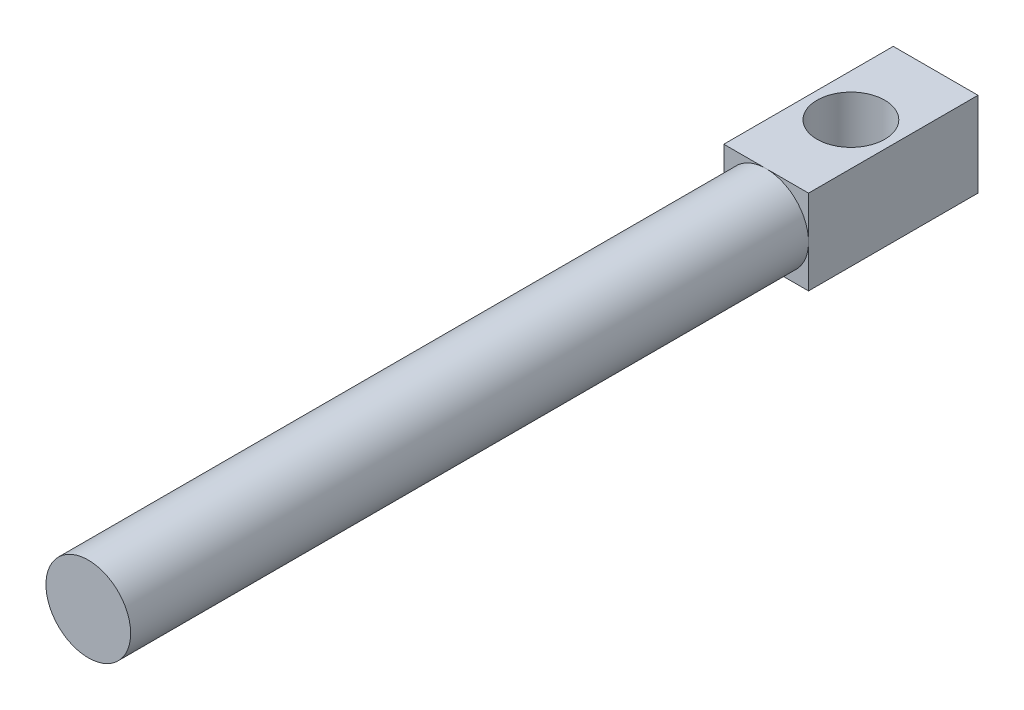
ISO-10303-21;
HEADER;
FILE_DESCRIPTION(('STEP AP214'),'2;1');
FILE_NAME('part.step','',(''),(''),'','','');
FILE_SCHEMA(('AUTOMOTIVE_DESIGN { 1 0 10303 214 1 1 1 1 }'));
ENDSEC;
DATA;
#1=APPLICATION_CONTEXT('core data for automotive mechanical design processes');
#2=APPLICATION_PROTOCOL_DEFINITION('international standard','automotive_design',2000,#1);
#3=PRODUCT_CONTEXT('',#1,'mechanical');
#4=PRODUCT('Part','Part','',(#3));
#5=PRODUCT_RELATED_PRODUCT_CATEGORY('part','',(#4));
#6=PRODUCT_DEFINITION_FORMATION('','',#4);
#7=PRODUCT_DEFINITION_CONTEXT('part definition',#1,'design');
#8=PRODUCT_DEFINITION('design','',#6,#7);
#9=PRODUCT_DEFINITION_SHAPE('','',#8);
#10=(LENGTH_UNIT() NAMED_UNIT(*) SI_UNIT(.MILLI.,.METRE.));
#11=(NAMED_UNIT(*) PLANE_ANGLE_UNIT() SI_UNIT($,.RADIAN.));
#12=(NAMED_UNIT(*) SI_UNIT($,.STERADIAN.) SOLID_ANGLE_UNIT());
#13=UNCERTAINTY_MEASURE_WITH_UNIT(LENGTH_MEASURE(1.E-05),#10,'distance_accuracy_value','');
#14=(GEOMETRIC_REPRESENTATION_CONTEXT(3) GLOBAL_UNCERTAINTY_ASSIGNED_CONTEXT((#13)) GLOBAL_UNIT_ASSIGNED_CONTEXT((#10,
#11,#12)) REPRESENTATION_CONTEXT('',''));
#15=CARTESIAN_POINT('',(0.,0.,0.));
#16=DIRECTION('',(0.,0.,1.));
#17=DIRECTION('',(1.,0.,0.));
#18=AXIS2_PLACEMENT_3D('',#15,#16,#17);
#19=CARTESIAN_POINT('',(0.,0.,150.));
#20=DIRECTION('',(0.,0.,-1.));
#21=DIRECTION('',(-1.,0.,0.));
#22=AXIS2_PLACEMENT_3D('',#19,#20,#21);
#23=CYLINDRICAL_SURFACE('',#22,7.5);
#24=CARTESIAN_POINT('',(0.,0.,150.));
#25=DIRECTION('',(0.,0.,1.));
#26=DIRECTION('',(1.,0.,0.));
#27=AXIS2_PLACEMENT_3D('',#24,#25,#26);
#28=CIRCLE('',#27,7.5);
#29=CARTESIAN_POINT('',(7.5,0.,150.));
#30=VERTEX_POINT('',#29);
#31=EDGE_CURVE('E108',#30,#30,#28,.T.);
#32=ORIENTED_EDGE('',*,*,#31,.F.);
#33=EDGE_LOOP('',(#32));
#34=FACE_BOUND('',#33,.T.);
#35=CARTESIAN_POINT('',(0.,0.,30.));
#36=DIRECTION('',(0.,0.,-1.));
#37=DIRECTION('',(-1.,0.,0.));
#38=AXIS2_PLACEMENT_3D('',#35,#36,#37);
#39=CIRCLE('',#38,7.5);
#40=CARTESIAN_POINT('',(0.,7.5,30.));
#41=VERTEX_POINT('',#40);
#42=CARTESIAN_POINT('',(7.5,0.,30.));
#43=VERTEX_POINT('',#42);
#44=EDGE_CURVE('E11',#41,#43,#39,.T.);
#45=ORIENTED_EDGE('',*,*,#44,.F.);
#46=CARTESIAN_POINT('',(-7.5,0.,30.));
#47=VERTEX_POINT('',#46);
#48=EDGE_CURVE('E89',#47,#41,#39,.T.);
#49=ORIENTED_EDGE('',*,*,#48,.F.);
#50=CARTESIAN_POINT('',(0.,-7.5,30.));
#51=VERTEX_POINT('',#50);
#52=EDGE_CURVE('E39',#51,#47,#39,.T.);
#53=ORIENTED_EDGE('',*,*,#52,.F.);
#54=EDGE_CURVE('E44',#43,#51,#39,.T.);
#55=ORIENTED_EDGE('',*,*,#54,.F.);
#56=EDGE_LOOP('',(#45,#49,#53,#55));
#57=FACE_BOUND('',#56,.T.);
#58=ADVANCED_FACE('F36',(#34,#57),#23,.T.);
#59=CARTESIAN_POINT('',(0.,0.,150.));
#60=DIRECTION('',(0.,0.,1.));
#61=DIRECTION('',(1.,0.,0.));
#62=AXIS2_PLACEMENT_3D('',#59,#60,#61);
#63=PLANE('',#62);
#64=ORIENTED_EDGE('',*,*,#31,.T.);
#65=EDGE_LOOP('',(#64));
#66=FACE_BOUND('',#65,.T.);
#67=ADVANCED_FACE('F162',(#66),#63,.T.);
#68=CARTESIAN_POINT('',(7.5,7.5,30.));
#69=DIRECTION('',(0.,0.,-1.));
#70=DIRECTION('',(-1.,0.,0.));
#71=AXIS2_PLACEMENT_3D('',#68,#69,#70);
#72=PLANE('',#71);
#73=DIRECTION('',(0.,-1.,0.));
#74=VECTOR('',#73,1.);
#75=CARTESIAN_POINT('',(-7.5,7.5,30.));
#76=LINE('',#75,#74);
#77=CARTESIAN_POINT('',(-7.5,7.5,30.));
#78=VERTEX_POINT('',#77);
#79=EDGE_CURVE('E88',#78,#47,#76,.T.);
#80=ORIENTED_EDGE('',*,*,#79,.T.);
#81=ORIENTED_EDGE('',*,*,#48,.T.);
#82=DIRECTION('',(1.,0.,0.));
#83=VECTOR('',#82,1.);
#84=CARTESIAN_POINT('',(7.5,7.5,30.));
#85=LINE('',#84,#83);
#86=EDGE_CURVE('E84',#78,#41,#85,.T.);
#87=ORIENTED_EDGE('',*,*,#86,.F.);
#88=EDGE_LOOP('',(#80,#81,#87));
#89=FACE_BOUND('',#88,.T.);
#90=ADVANCED_FACE('F86',(#89),#72,.F.);
#91=CARTESIAN_POINT('',(7.5,7.5,30.));
#92=VERTEX_POINT('',#91);
#93=EDGE_CURVE('E93',#41,#92,#85,.T.);
#94=ORIENTED_EDGE('',*,*,#93,.F.);
#95=ORIENTED_EDGE('',*,*,#44,.T.);
#96=DIRECTION('',(0.,-1.,0.));
#97=VECTOR('',#96,1.);
#98=CARTESIAN_POINT('',(7.5,7.5,30.));
#99=LINE('',#98,#97);
#100=EDGE_CURVE('E111',#92,#43,#99,.T.);
#101=ORIENTED_EDGE('',*,*,#100,.F.);
#102=EDGE_LOOP('',(#94,#95,#101));
#103=FACE_BOUND('',#102,.T.);
#104=ADVANCED_FACE('F173',(#103),#72,.F.);
#105=CARTESIAN_POINT('',(7.5,-7.5,30.));
#106=VERTEX_POINT('',#105);
#107=EDGE_CURVE('E115',#43,#106,#99,.T.);
#108=ORIENTED_EDGE('',*,*,#107,.F.);
#109=ORIENTED_EDGE('',*,*,#54,.T.);
#110=DIRECTION('',(1.,0.,0.));
#111=VECTOR('',#110,1.);
#112=CARTESIAN_POINT('',(7.5,-7.5,30.));
#113=LINE('',#112,#111);
#114=EDGE_CURVE('E128',#51,#106,#113,.T.);
#115=ORIENTED_EDGE('',*,*,#114,.T.);
#116=EDGE_LOOP('',(#108,#109,#115));
#117=FACE_BOUND('',#116,.T.);
#118=ADVANCED_FACE('F182',(#117),#72,.F.);
#119=CARTESIAN_POINT('',(-7.5,7.5,30.));
#120=DIRECTION('',(1.,0.,0.));
#121=DIRECTION('',(0.,0.,-1.));
#122=AXIS2_PLACEMENT_3D('',#119,#120,#121);
#123=PLANE('',#122);
#124=CARTESIAN_POINT('',(-7.5,-7.5,30.));
#125=VERTEX_POINT('',#124);
#126=EDGE_CURVE('E107',#47,#125,#76,.T.);
#127=ORIENTED_EDGE('',*,*,#126,.F.);
#128=ORIENTED_EDGE('',*,*,#79,.F.);
#129=DIRECTION('',(0.,0.,1.));
#130=VECTOR('',#129,1.);
#131=CARTESIAN_POINT('',(-7.5,7.5,30.));
#132=LINE('',#131,#130);
#133=CARTESIAN_POINT('',(-7.5,7.5,0.));
#134=VERTEX_POINT('',#133);
#135=EDGE_CURVE('E97',#134,#78,#132,.T.);
#136=ORIENTED_EDGE('',*,*,#135,.F.);
#137=DIRECTION('',(0.,-1.,0.));
#138=VECTOR('',#137,1.);
#139=CARTESIAN_POINT('',(-7.5,7.5,0.));
#140=LINE('',#139,#138);
#141=CARTESIAN_POINT('',(-7.5,-7.5,0.));
#142=VERTEX_POINT('',#141);
#143=EDGE_CURVE('E118',#134,#142,#140,.T.);
#144=ORIENTED_EDGE('',*,*,#143,.T.);
#145=DIRECTION('',(0.,0.,1.));
#146=VECTOR('',#145,1.);
#147=CARTESIAN_POINT('',(-7.5,-7.5,30.));
#148=LINE('',#147,#146);
#149=EDGE_CURVE('E129',#142,#125,#148,.T.);
#150=ORIENTED_EDGE('',*,*,#149,.T.);
#151=EDGE_LOOP('',(#127,#128,#136,#144,#150));
#152=FACE_BOUND('',#151,.T.);
#153=ADVANCED_FACE('F105',(#152),#123,.F.);
#154=CARTESIAN_POINT('',(7.5,7.5,30.));
#155=DIRECTION('',(-1.,0.,0.));
#156=DIRECTION('',(0.,0.,1.));
#157=AXIS2_PLACEMENT_3D('',#154,#155,#156);
#158=PLANE('',#157);
#159=ORIENTED_EDGE('',*,*,#100,.T.);
#160=ORIENTED_EDGE('',*,*,#107,.T.);
#161=DIRECTION('',(0.,0.,-1.));
#162=VECTOR('',#161,1.);
#163=CARTESIAN_POINT('',(7.5,-7.5,30.));
#164=LINE('',#163,#162);
#165=CARTESIAN_POINT('',(7.5,-7.5,0.));
#166=VERTEX_POINT('',#165);
#167=EDGE_CURVE('E122',#106,#166,#164,.T.);
#168=ORIENTED_EDGE('',*,*,#167,.T.);
#169=DIRECTION('',(0.,-1.,0.));
#170=VECTOR('',#169,1.);
#171=CARTESIAN_POINT('',(7.5,7.5,0.));
#172=LINE('',#171,#170);
#173=CARTESIAN_POINT('',(7.5,7.5,0.));
#174=VERTEX_POINT('',#173);
#175=EDGE_CURVE('E116',#174,#166,#172,.T.);
#176=ORIENTED_EDGE('',*,*,#175,.F.);
#177=DIRECTION('',(0.,0.,-1.));
#178=VECTOR('',#177,1.);
#179=CARTESIAN_POINT('',(7.5,7.5,30.));
#180=LINE('',#179,#178);
#181=EDGE_CURVE('E92',#92,#174,#180,.T.);
#182=ORIENTED_EDGE('',*,*,#181,.F.);
#183=EDGE_LOOP('',(#159,#160,#168,#176,#182));
#184=FACE_BOUND('',#183,.T.);
#185=ADVANCED_FACE('F151',(#184),#158,.F.);
#186=CARTESIAN_POINT('',(0.,7.5,0.));
#187=DIRECTION('',(0.,1.,0.));
#188=DIRECTION('',(0.,0.,1.));
#189=AXIS2_PLACEMENT_3D('',#186,#187,#188);
#190=PLANE('',#189);
#191=CARTESIAN_POINT('',(0.,7.5,15.));
#192=DIRECTION('',(0.,1.,0.));
#193=DIRECTION('',(0.,0.,1.));
#194=AXIS2_PLACEMENT_3D('',#191,#192,#193);
#195=CIRCLE('',#194,6.);
#196=CARTESIAN_POINT('',(0.,7.5,21.));
#197=VERTEX_POINT('',#196);
#198=EDGE_CURVE('E134',#197,#197,#195,.T.);
#199=ORIENTED_EDGE('',*,*,#198,.F.);
#200=EDGE_LOOP('',(#199));
#201=FACE_BOUND('',#200,.T.);
#202=DIRECTION('',(-1.,0.,0.));
#203=VECTOR('',#202,1.);
#204=CARTESIAN_POINT('',(7.5,7.5,0.));
#205=LINE('',#204,#203);
#206=EDGE_CURVE('E100',#174,#134,#205,.T.);
#207=ORIENTED_EDGE('',*,*,#206,.T.);
#208=ORIENTED_EDGE('',*,*,#135,.T.);
#209=ORIENTED_EDGE('',*,*,#86,.T.);
#210=ORIENTED_EDGE('',*,*,#93,.T.);
#211=ORIENTED_EDGE('',*,*,#181,.T.);
#212=EDGE_LOOP('',(#207,#208,#209,#210,#211));
#213=FACE_BOUND('',#212,.T.);
#214=ADVANCED_FACE('F98',(#201,#213),#190,.T.);
#215=CARTESIAN_POINT('',(0.,-7.5,0.));
#216=DIRECTION('',(0.,1.,0.));
#217=DIRECTION('',(0.,0.,1.));
#218=AXIS2_PLACEMENT_3D('',#215,#216,#217);
#219=PLANE('',#218);
#220=CARTESIAN_POINT('',(0.,-7.5,15.));
#221=DIRECTION('',(0.,1.,0.));
#222=DIRECTION('',(0.,0.,1.));
#223=AXIS2_PLACEMENT_3D('',#220,#221,#222);
#224=CIRCLE('',#223,6.);
#225=CARTESIAN_POINT('',(0.,-7.5,21.));
#226=VERTEX_POINT('',#225);
#227=EDGE_CURVE('E131',#226,#226,#224,.T.);
#228=ORIENTED_EDGE('',*,*,#227,.T.);
#229=EDGE_LOOP('',(#228));
#230=FACE_BOUND('',#229,.T.);
#231=ORIENTED_EDGE('',*,*,#114,.F.);
#232=EDGE_CURVE('E125',#125,#51,#113,.T.);
#233=ORIENTED_EDGE('',*,*,#232,.F.);
#234=ORIENTED_EDGE('',*,*,#149,.F.);
#235=DIRECTION('',(-1.,0.,0.));
#236=VECTOR('',#235,1.);
#237=CARTESIAN_POINT('',(7.5,-7.5,0.));
#238=LINE('',#237,#236);
#239=EDGE_CURVE('E102',#166,#142,#238,.T.);
#240=ORIENTED_EDGE('',*,*,#239,.F.);
#241=ORIENTED_EDGE('',*,*,#167,.F.);
#242=EDGE_LOOP('',(#231,#233,#234,#240,#241));
#243=FACE_BOUND('',#242,.T.);
#244=ADVANCED_FACE('F140',(#230,#243),#219,.F.);
#245=ORIENTED_EDGE('',*,*,#232,.T.);
#246=ORIENTED_EDGE('',*,*,#52,.T.);
#247=ORIENTED_EDGE('',*,*,#126,.T.);
#248=EDGE_LOOP('',(#245,#246,#247));
#249=FACE_BOUND('',#248,.T.);
#250=ADVANCED_FACE('F157',(#249),#72,.F.);
#251=CARTESIAN_POINT('',(0.,0.,0.));
#252=DIRECTION('',(0.,0.,1.));
#253=DIRECTION('',(1.,0.,0.));
#254=AXIS2_PLACEMENT_3D('',#251,#252,#253);
#255=PLANE('',#254);
#256=ORIENTED_EDGE('',*,*,#143,.F.);
#257=ORIENTED_EDGE('',*,*,#206,.F.);
#258=ORIENTED_EDGE('',*,*,#175,.T.);
#259=ORIENTED_EDGE('',*,*,#239,.T.);
#260=EDGE_LOOP('',(#256,#257,#258,#259));
#261=FACE_BOUND('',#260,.T.);
#262=ADVANCED_FACE('F146',(#261),#255,.F.);
#263=CARTESIAN_POINT('',(0.,-7.5,15.));
#264=DIRECTION('',(0.,1.,0.));
#265=DIRECTION('',(0.,0.,1.));
#266=AXIS2_PLACEMENT_3D('',#263,#264,#265);
#267=CYLINDRICAL_SURFACE('',#266,6.);
#268=ORIENTED_EDGE('',*,*,#227,.F.);
#269=EDGE_LOOP('',(#268));
#270=FACE_BOUND('',#269,.T.);
#271=ORIENTED_EDGE('',*,*,#198,.T.);
#272=EDGE_LOOP('',(#271));
#273=FACE_BOUND('',#272,.T.);
#274=ADVANCED_FACE('F143',(#270,#273),#267,.F.);
#275=CLOSED_SHELL('',(#58,#67,#90,#104,#118,#153,#185,#214,#244,#250,#262,#274));
#276=MANIFOLD_SOLID_BREP('B2',#275);
#277=ADVANCED_BREP_SHAPE_REPRESENTATION('',(#18,#276),#14);
#278=SHAPE_DEFINITION_REPRESENTATION(#9,#277);
ENDSEC;
END-ISO-10303-21;
